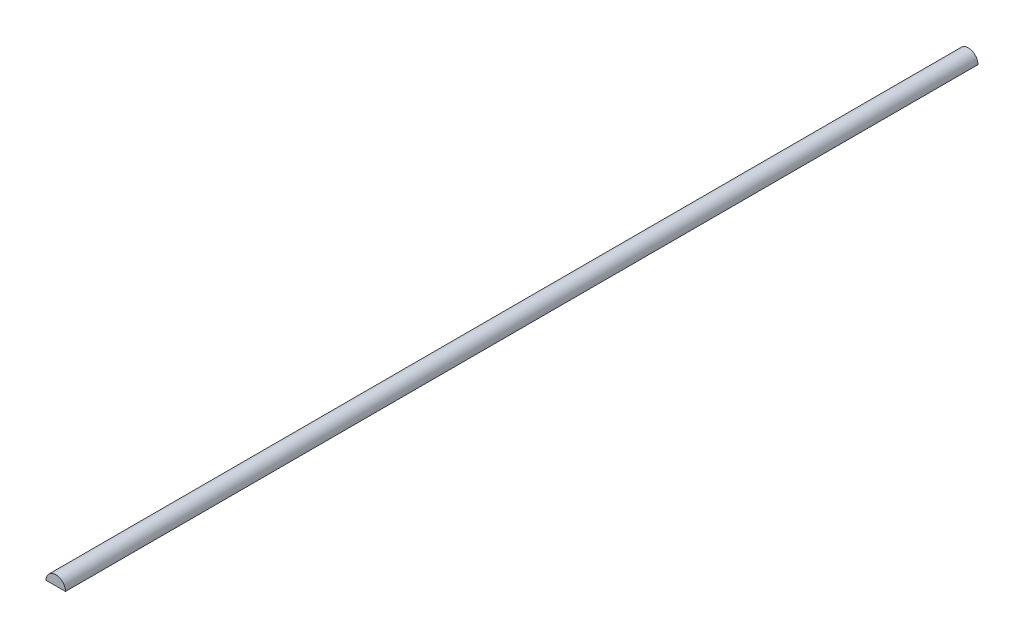
ISO-10303-21;
HEADER;
FILE_DESCRIPTION(('STEP AP214'),'2;1');
FILE_NAME('part.step','',(''),(''),'','','');
FILE_SCHEMA(('AUTOMOTIVE_DESIGN { 1 0 10303 214 1 1 1 1 }'));
ENDSEC;
DATA;
#1=APPLICATION_CONTEXT('core data for automotive mechanical design processes');
#2=APPLICATION_PROTOCOL_DEFINITION('international standard','automotive_design',2000,#1);
#3=PRODUCT_CONTEXT('',#1,'mechanical');
#4=PRODUCT('Part','Part','',(#3));
#5=PRODUCT_RELATED_PRODUCT_CATEGORY('part','',(#4));
#6=PRODUCT_DEFINITION_FORMATION('','',#4);
#7=PRODUCT_DEFINITION_CONTEXT('part definition',#1,'design');
#8=PRODUCT_DEFINITION('design','',#6,#7);
#9=PRODUCT_DEFINITION_SHAPE('','',#8);
#10=(LENGTH_UNIT() NAMED_UNIT(*) SI_UNIT(.MILLI.,.METRE.));
#11=(NAMED_UNIT(*) PLANE_ANGLE_UNIT() SI_UNIT($,.RADIAN.));
#12=(NAMED_UNIT(*) SI_UNIT($,.STERADIAN.) SOLID_ANGLE_UNIT());
#13=UNCERTAINTY_MEASURE_WITH_UNIT(LENGTH_MEASURE(1.E-05),#10,'distance_accuracy_value','');
#14=(GEOMETRIC_REPRESENTATION_CONTEXT(3) GLOBAL_UNCERTAINTY_ASSIGNED_CONTEXT((#13)) GLOBAL_UNIT_ASSIGNED_CONTEXT((#10,
#11,#12)) REPRESENTATION_CONTEXT('',''));
#15=CARTESIAN_POINT('',(0.,0.,0.));
#16=DIRECTION('',(0.,0.,1.));
#17=DIRECTION('',(1.,0.,0.));
#18=AXIS2_PLACEMENT_3D('',#15,#16,#17);
#19=CARTESIAN_POINT('',(0.,0.,380.));
#20=DIRECTION('',(0.,1.,0.));
#21=DIRECTION('',(0.,0.,1.));
#22=AXIS2_PLACEMENT_3D('',#19,#20,#21);
#23=PLANE('',#22);
#24=DIRECTION('',(1.,0.,0.));
#25=VECTOR('',#24,1.);
#26=CARTESIAN_POINT('',(0.,0.,0.));
#27=LINE('',#26,#25);
#28=CARTESIAN_POINT('',(-4.05,0.,0.));
#29=VERTEX_POINT('',#28);
#30=CARTESIAN_POINT('',(4.05,0.,0.));
#31=VERTEX_POINT('',#30);
#32=EDGE_CURVE('E70',#29,#31,#27,.T.);
#33=ORIENTED_EDGE('',*,*,#32,.T.);
#34=DIRECTION('',(0.,0.,-1.));
#35=VECTOR('',#34,1.);
#36=CARTESIAN_POINT('',(4.05,0.,380.));
#37=LINE('',#36,#35);
#38=CARTESIAN_POINT('',(4.05,0.,380.));
#39=VERTEX_POINT('',#38);
#40=EDGE_CURVE('E12',#39,#31,#37,.T.);
#41=ORIENTED_EDGE('',*,*,#40,.F.);
#42=DIRECTION('',(1.,0.,0.));
#43=VECTOR('',#42,1.);
#44=CARTESIAN_POINT('',(0.,0.,380.));
#45=LINE('',#44,#43);
#46=CARTESIAN_POINT('',(-4.05,0.,380.));
#47=VERTEX_POINT('',#46);
#48=EDGE_CURVE('E82',#47,#39,#45,.T.);
#49=ORIENTED_EDGE('',*,*,#48,.F.);
#50=DIRECTION('',(0.,0.,-1.));
#51=VECTOR('',#50,1.);
#52=CARTESIAN_POINT('',(-4.05,0.,380.));
#53=LINE('',#52,#51);
#54=EDGE_CURVE('E54',#47,#29,#53,.T.);
#55=ORIENTED_EDGE('',*,*,#54,.T.);
#56=EDGE_LOOP('',(#33,#41,#49,#55));
#57=FACE_BOUND('',#56,.T.);
#58=ADVANCED_FACE('F44',(#57),#23,.F.);
#59=CARTESIAN_POINT('',(0.,0.,380.));
#60=DIRECTION('',(0.,0.,-1.));
#61=DIRECTION('',(-1.,0.,0.));
#62=AXIS2_PLACEMENT_3D('',#59,#60,#61);
#63=CYLINDRICAL_SURFACE('',#62,4.05);
#64=CARTESIAN_POINT('',(0.,0.,0.));
#65=DIRECTION('',(0.,0.,1.));
#66=DIRECTION('',(1.,0.,0.));
#67=AXIS2_PLACEMENT_3D('',#64,#65,#66);
#68=CIRCLE('',#67,4.05);
#69=EDGE_CURVE('E75',#31,#29,#68,.T.);
#70=ORIENTED_EDGE('',*,*,#69,.T.);
#71=ORIENTED_EDGE('',*,*,#54,.F.);
#72=CARTESIAN_POINT('',(0.,0.,380.));
#73=DIRECTION('',(0.,0.,1.));
#74=DIRECTION('',(1.,0.,0.));
#75=AXIS2_PLACEMENT_3D('',#72,#73,#74);
#76=CIRCLE('',#75,4.05);
#77=EDGE_CURVE('E61',#39,#47,#76,.T.);
#78=ORIENTED_EDGE('',*,*,#77,.F.);
#79=ORIENTED_EDGE('',*,*,#40,.T.);
#80=EDGE_LOOP('',(#70,#71,#78,#79));
#81=FACE_BOUND('',#80,.T.);
#82=ADVANCED_FACE('F79',(#81),#63,.T.);
#83=CARTESIAN_POINT('',(0.,0.,380.));
#84=DIRECTION('',(0.,0.,1.));
#85=DIRECTION('',(1.,0.,0.));
#86=AXIS2_PLACEMENT_3D('',#83,#84,#85);
#87=PLANE('',#86);
#88=ORIENTED_EDGE('',*,*,#48,.T.);
#89=ORIENTED_EDGE('',*,*,#77,.T.);
#90=EDGE_LOOP('',(#88,#89));
#91=FACE_BOUND('',#90,.T.);
#92=ADVANCED_FACE('F91',(#91),#87,.T.);
#93=CARTESIAN_POINT('',(0.,0.,0.));
#94=DIRECTION('',(0.,0.,1.));
#95=DIRECTION('',(1.,0.,0.));
#96=AXIS2_PLACEMENT_3D('',#93,#94,#95);
#97=PLANE('',#96);
#98=ORIENTED_EDGE('',*,*,#32,.F.);
#99=ORIENTED_EDGE('',*,*,#69,.F.);
#100=EDGE_LOOP('',(#98,#99));
#101=FACE_BOUND('',#100,.T.);
#102=ADVANCED_FACE('F74',(#101),#97,.F.);
#103=CLOSED_SHELL('',(#58,#82,#92,#102));
#104=MANIFOLD_SOLID_BREP('B2',#103);
#105=ADVANCED_BREP_SHAPE_REPRESENTATION('',(#18,#104),#14);
#106=SHAPE_DEFINITION_REPRESENTATION(#9,#105);
ENDSEC;
END-ISO-10303-21;
